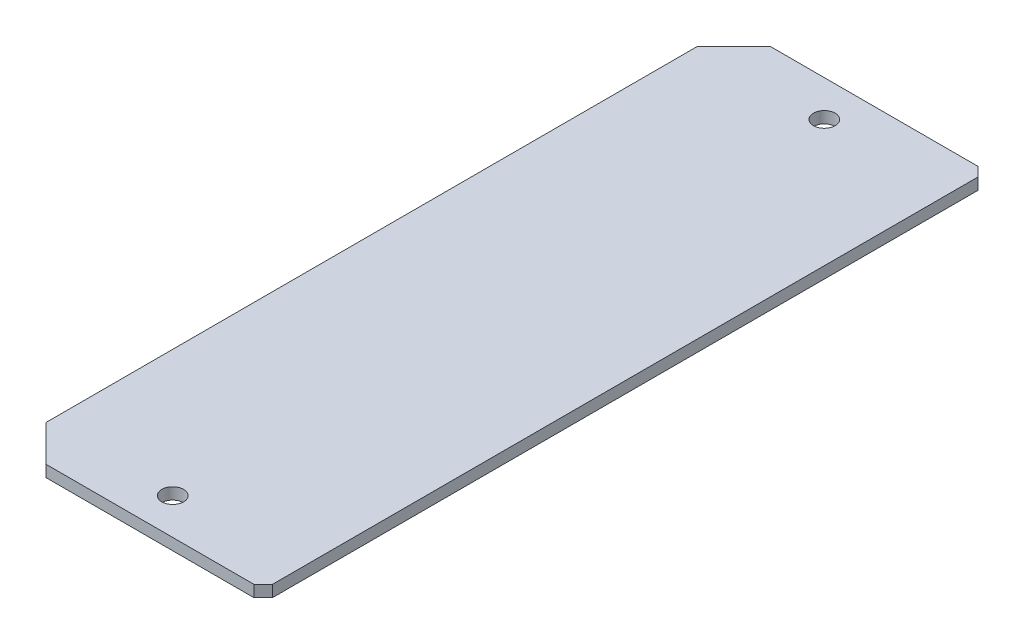
ISO-10303-21;
HEADER;
FILE_DESCRIPTION(('STEP AP214'),'2;1');
FILE_NAME('part.step','',(''),(''),'','','');
FILE_SCHEMA(('AUTOMOTIVE_DESIGN { 1 0 10303 214 1 1 1 1 }'));
ENDSEC;
DATA;
#1=APPLICATION_CONTEXT('core data for automotive mechanical design processes');
#2=APPLICATION_PROTOCOL_DEFINITION('international standard','automotive_design',2000,#1);
#3=PRODUCT_CONTEXT('',#1,'mechanical');
#4=PRODUCT('Part','Part','',(#3));
#5=PRODUCT_RELATED_PRODUCT_CATEGORY('part','',(#4));
#6=PRODUCT_DEFINITION_FORMATION('','',#4);
#7=PRODUCT_DEFINITION_CONTEXT('part definition',#1,'design');
#8=PRODUCT_DEFINITION('design','',#6,#7);
#9=PRODUCT_DEFINITION_SHAPE('','',#8);
#10=(LENGTH_UNIT() NAMED_UNIT(*) SI_UNIT(.MILLI.,.METRE.));
#11=(NAMED_UNIT(*) PLANE_ANGLE_UNIT() SI_UNIT($,.RADIAN.));
#12=(NAMED_UNIT(*) SI_UNIT($,.STERADIAN.) SOLID_ANGLE_UNIT());
#13=UNCERTAINTY_MEASURE_WITH_UNIT(LENGTH_MEASURE(1.E-05),#10,'distance_accuracy_value','');
#14=(GEOMETRIC_REPRESENTATION_CONTEXT(3) GLOBAL_UNCERTAINTY_ASSIGNED_CONTEXT((#13)) GLOBAL_UNIT_ASSIGNED_CONTEXT((#10,
#11,#12)) REPRESENTATION_CONTEXT('',''));
#15=CARTESIAN_POINT('',(0.,0.,0.));
#16=DIRECTION('',(0.,0.,1.));
#17=DIRECTION('',(1.,0.,0.));
#18=AXIS2_PLACEMENT_3D('',#15,#16,#17);
#19=CARTESIAN_POINT('',(17.5,1.6,-50.));
#20=DIRECTION('',(-1.,0.,0.));
#21=DIRECTION('',(0.,0.,1.));
#22=AXIS2_PLACEMENT_3D('',#19,#20,#21);
#23=PLANE('',#22);
#24=DIRECTION('',(0.,0.,-1.));
#25=VECTOR('',#24,1.);
#26=CARTESIAN_POINT('',(17.5,1.6,-50.));
#27=LINE('',#26,#25);
#28=CARTESIAN_POINT('',(17.5,1.6,48.73));
#29=VERTEX_POINT('',#28);
#30=CARTESIAN_POINT('',(17.5,1.6,-48.73));
#31=VERTEX_POINT('',#30);
#32=EDGE_CURVE('E130',#29,#31,#27,.T.);
#33=ORIENTED_EDGE('',*,*,#32,.F.);
#34=DIRECTION('',(0.,-1.,0.));
#35=VECTOR('',#34,1.);
#36=CARTESIAN_POINT('',(17.5,1.6,48.73));
#37=LINE('',#36,#35);
#38=CARTESIAN_POINT('',(17.5,0.,48.7300000000001));
#39=VERTEX_POINT('',#38);
#40=EDGE_CURVE('E149',#29,#39,#37,.T.);
#41=ORIENTED_EDGE('',*,*,#40,.T.);
#42=DIRECTION('',(0.,0.,-1.));
#43=VECTOR('',#42,1.);
#44=CARTESIAN_POINT('',(17.5,0.,-50.));
#45=LINE('',#44,#43);
#46=CARTESIAN_POINT('',(17.5,0.,-48.73));
#47=VERTEX_POINT('',#46);
#48=EDGE_CURVE('E132',#39,#47,#45,.T.);
#49=ORIENTED_EDGE('',*,*,#48,.T.);
#50=DIRECTION('',(0.,1.,0.));
#51=VECTOR('',#50,1.);
#52=CARTESIAN_POINT('',(17.5,1.6,-48.73));
#53=LINE('',#52,#51);
#54=EDGE_CURVE('E147',#47,#31,#53,.T.);
#55=ORIENTED_EDGE('',*,*,#54,.T.);
#56=EDGE_LOOP('',(#33,#41,#49,#55));
#57=FACE_BOUND('',#56,.T.);
#58=ADVANCED_FACE('F31',(#57),#23,.F.);
#59=CARTESIAN_POINT('',(-17.5,1.6,-50.));
#60=DIRECTION('',(0.,0.,1.));
#61=DIRECTION('',(1.,0.,0.));
#62=AXIS2_PLACEMENT_3D('',#59,#60,#61);
#63=PLANE('',#62);
#64=DIRECTION('',(-1.,0.,0.));
#65=VECTOR('',#64,1.);
#66=CARTESIAN_POINT('',(-17.5,1.6,-50.));
#67=LINE('',#66,#65);
#68=CARTESIAN_POINT('',(16.23,1.6,-50.));
#69=VERTEX_POINT('',#68);
#70=CARTESIAN_POINT('',(-12.5,1.6,-50.));
#71=VERTEX_POINT('',#70);
#72=EDGE_CURVE('E173',#69,#71,#67,.T.);
#73=ORIENTED_EDGE('',*,*,#72,.F.);
#74=DIRECTION('',(0.,-1.,0.));
#75=VECTOR('',#74,1.);
#76=CARTESIAN_POINT('',(16.23,1.6,-50.));
#77=LINE('',#76,#75);
#78=CARTESIAN_POINT('',(16.23,0.,-50.));
#79=VERTEX_POINT('',#78);
#80=EDGE_CURVE('E11',#69,#79,#77,.T.);
#81=ORIENTED_EDGE('',*,*,#80,.T.);
#82=DIRECTION('',(-1.,0.,0.));
#83=VECTOR('',#82,1.);
#84=CARTESIAN_POINT('',(-17.5,0.,-50.));
#85=LINE('',#84,#83);
#86=CARTESIAN_POINT('',(-12.5,0.,-50.));
#87=VERTEX_POINT('',#86);
#88=EDGE_CURVE('E128',#79,#87,#85,.T.);
#89=ORIENTED_EDGE('',*,*,#88,.T.);
#90=DIRECTION('',(0.,1.,0.));
#91=VECTOR('',#90,1.);
#92=CARTESIAN_POINT('',(-12.5,1.6,-50.));
#93=LINE('',#92,#91);
#94=EDGE_CURVE('E108',#87,#71,#93,.T.);
#95=ORIENTED_EDGE('',*,*,#94,.T.);
#96=EDGE_LOOP('',(#73,#81,#89,#95));
#97=FACE_BOUND('',#96,.T.);
#98=ADVANCED_FACE('F189',(#97),#63,.F.);
#99=CARTESIAN_POINT('',(-17.5,1.6,-50.));
#100=DIRECTION('',(1.,0.,0.));
#101=DIRECTION('',(0.,0.,-1.));
#102=AXIS2_PLACEMENT_3D('',#99,#100,#101);
#103=PLANE('',#102);
#104=DIRECTION('',(0.,0.,1.));
#105=VECTOR('',#104,1.);
#106=CARTESIAN_POINT('',(-17.5,1.6,-50.));
#107=LINE('',#106,#105);
#108=CARTESIAN_POINT('',(-17.5,1.6,-45.));
#109=VERTEX_POINT('',#108);
#110=CARTESIAN_POINT('',(-17.5,1.6,44.9999999999999));
#111=VERTEX_POINT('',#110);
#112=EDGE_CURVE('E121',#109,#111,#107,.T.);
#113=ORIENTED_EDGE('',*,*,#112,.F.);
#114=DIRECTION('',(0.,-1.,0.));
#115=VECTOR('',#114,1.);
#116=CARTESIAN_POINT('',(-17.5,1.6,-45.));
#117=LINE('',#116,#115);
#118=CARTESIAN_POINT('',(-17.5,0.,-45.));
#119=VERTEX_POINT('',#118);
#120=EDGE_CURVE('E106',#109,#119,#117,.T.);
#121=ORIENTED_EDGE('',*,*,#120,.T.);
#122=DIRECTION('',(0.,0.,1.));
#123=VECTOR('',#122,1.);
#124=CARTESIAN_POINT('',(-17.5,0.,-50.));
#125=LINE('',#124,#123);
#126=CARTESIAN_POINT('',(-17.5,0.,45.));
#127=VERTEX_POINT('',#126);
#128=EDGE_CURVE('E118',#119,#127,#125,.T.);
#129=ORIENTED_EDGE('',*,*,#128,.T.);
#130=DIRECTION('',(0.,1.,0.));
#131=VECTOR('',#130,1.);
#132=CARTESIAN_POINT('',(-17.5,1.6,45.));
#133=LINE('',#132,#131);
#134=EDGE_CURVE('E122',#127,#111,#133,.T.);
#135=ORIENTED_EDGE('',*,*,#134,.T.);
#136=EDGE_LOOP('',(#113,#121,#129,#135));
#137=FACE_BOUND('',#136,.T.);
#138=ADVANCED_FACE('F117',(#137),#103,.F.);
#139=CARTESIAN_POINT('',(-17.5,1.6,50.));
#140=DIRECTION('',(0.,0.,-1.));
#141=DIRECTION('',(-1.,0.,0.));
#142=AXIS2_PLACEMENT_3D('',#139,#140,#141);
#143=PLANE('',#142);
#144=DIRECTION('',(1.,0.,0.));
#145=VECTOR('',#144,1.);
#146=CARTESIAN_POINT('',(-17.5,0.,50.));
#147=LINE('',#146,#145);
#148=CARTESIAN_POINT('',(-12.5,0.,50.));
#149=VERTEX_POINT('',#148);
#150=CARTESIAN_POINT('',(16.23,0.,50.));
#151=VERTEX_POINT('',#150);
#152=EDGE_CURVE('E127',#149,#151,#147,.T.);
#153=ORIENTED_EDGE('',*,*,#152,.T.);
#154=DIRECTION('',(0.,1.,0.));
#155=VECTOR('',#154,1.);
#156=CARTESIAN_POINT('',(16.23,1.6,50.));
#157=LINE('',#156,#155);
#158=CARTESIAN_POINT('',(16.23,1.6,50.));
#159=VERTEX_POINT('',#158);
#160=EDGE_CURVE('E56',#151,#159,#157,.T.);
#161=ORIENTED_EDGE('',*,*,#160,.T.);
#162=DIRECTION('',(1.,0.,0.));
#163=VECTOR('',#162,1.);
#164=CARTESIAN_POINT('',(-17.5,1.6,50.));
#165=LINE('',#164,#163);
#166=CARTESIAN_POINT('',(-12.5,1.6,50.));
#167=VERTEX_POINT('',#166);
#168=EDGE_CURVE('E136',#167,#159,#165,.T.);
#169=ORIENTED_EDGE('',*,*,#168,.F.);
#170=DIRECTION('',(0.,-1.,0.));
#171=VECTOR('',#170,1.);
#172=CARTESIAN_POINT('',(-12.5,1.6,50.));
#173=LINE('',#172,#171);
#174=EDGE_CURVE('E144',#167,#149,#173,.T.);
#175=ORIENTED_EDGE('',*,*,#174,.T.);
#176=EDGE_LOOP('',(#153,#161,#169,#175));
#177=FACE_BOUND('',#176,.T.);
#178=ADVANCED_FACE('F192',(#177),#143,.F.);
#179=CARTESIAN_POINT('',(17.5,1.6,50.));
#180=DIRECTION('',(0.,1.,0.));
#181=DIRECTION('',(0.,0.,1.));
#182=AXIS2_PLACEMENT_3D('',#179,#180,#181);
#183=PLANE('',#182);
#184=CARTESIAN_POINT('',(0.,1.6,45.));
#185=DIRECTION('',(0.,1.,0.));
#186=DIRECTION('',(0.,0.,1.));
#187=AXIS2_PLACEMENT_3D('',#184,#185,#186);
#188=CIRCLE('',#187,1.5);
#189=CARTESIAN_POINT('',(0.,1.6,46.5));
#190=VERTEX_POINT('',#189);
#191=EDGE_CURVE('E169',#190,#190,#188,.T.);
#192=ORIENTED_EDGE('',*,*,#191,.F.);
#193=EDGE_LOOP('',(#192));
#194=FACE_BOUND('',#193,.T.);
#195=CARTESIAN_POINT('',(0.,1.6,-45.));
#196=DIRECTION('',(0.,1.,0.));
#197=DIRECTION('',(0.,0.,1.));
#198=AXIS2_PLACEMENT_3D('',#195,#196,#197);
#199=CIRCLE('',#198,1.5);
#200=CARTESIAN_POINT('',(0.,1.6,-43.5));
#201=VERTEX_POINT('',#200);
#202=EDGE_CURVE('E160',#201,#201,#199,.T.);
#203=ORIENTED_EDGE('',*,*,#202,.F.);
#204=EDGE_LOOP('',(#203));
#205=FACE_BOUND('',#204,.T.);
#206=ORIENTED_EDGE('',*,*,#168,.T.);
#207=DIRECTION('',(-0.707106781186551,0.,0.707106781186544));
#208=VECTOR('',#207,1.);
#209=CARTESIAN_POINT('',(16.865,1.6,49.365));
#210=LINE('',#209,#208);
#211=EDGE_CURVE('E40',#159,#29,#210,.F.);
#212=ORIENTED_EDGE('',*,*,#211,.T.);
#213=ORIENTED_EDGE('',*,*,#32,.T.);
#214=DIRECTION('',(0.707106781186548,0.,0.707106781186548));
#215=VECTOR('',#214,1.);
#216=CARTESIAN_POINT('',(66.865,1.6,0.635000000000018));
#217=LINE('',#216,#215);
#218=EDGE_CURVE('E48',#31,#69,#217,.F.);
#219=ORIENTED_EDGE('',*,*,#218,.T.);
#220=ORIENTED_EDGE('',*,*,#72,.T.);
#221=DIRECTION('',(0.707106781186549,0.,-0.707106781186546));
#222=VECTOR('',#221,1.);
#223=CARTESIAN_POINT('',(-47.4999999999999,1.6,-15.0000000000003));
#224=LINE('',#223,#222);
#225=EDGE_CURVE('E142',#71,#109,#224,.F.);
#226=ORIENTED_EDGE('',*,*,#225,.T.);
#227=ORIENTED_EDGE('',*,*,#112,.T.);
#228=DIRECTION('',(-0.707106781186547,0.,-0.707106781186549));
#229=VECTOR('',#228,1.);
#230=CARTESIAN_POINT('',(2.49999999999997,1.6,65.));
#231=LINE('',#230,#229);
#232=EDGE_CURVE('E140',#111,#167,#231,.F.);
#233=ORIENTED_EDGE('',*,*,#232,.T.);
#234=EDGE_LOOP('',(#206,#212,#213,#219,#220,#226,#227,#233));
#235=FACE_BOUND('',#234,.T.);
#236=ADVANCED_FACE('F177',(#194,#205,#235),#183,.T.);
#237=CARTESIAN_POINT('',(17.5,0.,50.));
#238=DIRECTION('',(0.,1.,0.));
#239=DIRECTION('',(0.,0.,1.));
#240=AXIS2_PLACEMENT_3D('',#237,#238,#239);
#241=PLANE('',#240);
#242=CARTESIAN_POINT('',(0.,0.,45.));
#243=DIRECTION('',(0.,1.,0.));
#244=DIRECTION('',(0.,0.,1.));
#245=AXIS2_PLACEMENT_3D('',#242,#243,#244);
#246=CIRCLE('',#245,1.5);
#247=CARTESIAN_POINT('',(0.,0.,46.5));
#248=VERTEX_POINT('',#247);
#249=EDGE_CURVE('E35',#248,#248,#246,.T.);
#250=ORIENTED_EDGE('',*,*,#249,.T.);
#251=EDGE_LOOP('',(#250));
#252=FACE_BOUND('',#251,.T.);
#253=CARTESIAN_POINT('',(0.,0.,-45.));
#254=DIRECTION('',(0.,1.,0.));
#255=DIRECTION('',(0.,0.,1.));
#256=AXIS2_PLACEMENT_3D('',#253,#254,#255);
#257=CIRCLE('',#256,1.5);
#258=CARTESIAN_POINT('',(0.,0.,-43.5));
#259=VERTEX_POINT('',#258);
#260=EDGE_CURVE('E158',#259,#259,#257,.T.);
#261=ORIENTED_EDGE('',*,*,#260,.T.);
#262=EDGE_LOOP('',(#261));
#263=FACE_BOUND('',#262,.T.);
#264=ORIENTED_EDGE('',*,*,#48,.F.);
#265=DIRECTION('',(0.707106781186551,0.,-0.707106781186544));
#266=VECTOR('',#265,1.);
#267=CARTESIAN_POINT('',(17.5,0.,48.73));
#268=LINE('',#267,#266);
#269=EDGE_CURVE('E154',#39,#151,#268,.F.);
#270=ORIENTED_EDGE('',*,*,#269,.T.);
#271=ORIENTED_EDGE('',*,*,#152,.F.);
#272=DIRECTION('',(0.707106781186547,0.,0.707106781186549));
#273=VECTOR('',#272,1.);
#274=CARTESIAN_POINT('',(-12.5,0.,50.));
#275=LINE('',#274,#273);
#276=EDGE_CURVE('E112',#149,#127,#275,.F.);
#277=ORIENTED_EDGE('',*,*,#276,.T.);
#278=ORIENTED_EDGE('',*,*,#128,.F.);
#279=DIRECTION('',(-0.707106781186549,0.,0.707106781186546));
#280=VECTOR('',#279,1.);
#281=CARTESIAN_POINT('',(-17.5,0.,-45.));
#282=LINE('',#281,#280);
#283=EDGE_CURVE('E102',#119,#87,#282,.F.);
#284=ORIENTED_EDGE('',*,*,#283,.T.);
#285=ORIENTED_EDGE('',*,*,#88,.F.);
#286=DIRECTION('',(-0.707106781186548,0.,-0.707106781186548));
#287=VECTOR('',#286,1.);
#288=CARTESIAN_POINT('',(16.23,0.,-50.));
#289=LINE('',#288,#287);
#290=EDGE_CURVE('E152',#79,#47,#289,.F.);
#291=ORIENTED_EDGE('',*,*,#290,.T.);
#292=EDGE_LOOP('',(#264,#270,#271,#277,#278,#284,#285,#291));
#293=FACE_BOUND('',#292,.T.);
#294=ADVANCED_FACE('F125',(#252,#263,#293),#241,.F.);
#295=CARTESIAN_POINT('',(-17.5,1.6,-45.));
#296=DIRECTION('',(0.707106781186545,0.,0.707106781186549));
#297=DIRECTION('',(0.707106781186549,0.,-0.707106781186546));
#298=AXIS2_PLACEMENT_3D('',#295,#296,#297);
#299=PLANE('',#298);
#300=ORIENTED_EDGE('',*,*,#225,.F.);
#301=ORIENTED_EDGE('',*,*,#94,.F.);
#302=ORIENTED_EDGE('',*,*,#283,.F.);
#303=ORIENTED_EDGE('',*,*,#120,.F.);
#304=EDGE_LOOP('',(#300,#301,#302,#303));
#305=FACE_BOUND('',#304,.T.);
#306=ADVANCED_FACE('F105',(#305),#299,.F.);
#307=CARTESIAN_POINT('',(-12.5,1.6,50.));
#308=DIRECTION('',(0.707106781186549,0.,-0.707106781186547));
#309=DIRECTION('',(-0.707106781186547,0.,-0.707106781186549));
#310=AXIS2_PLACEMENT_3D('',#307,#308,#309);
#311=PLANE('',#310);
#312=ORIENTED_EDGE('',*,*,#232,.F.);
#313=ORIENTED_EDGE('',*,*,#134,.F.);
#314=ORIENTED_EDGE('',*,*,#276,.F.);
#315=ORIENTED_EDGE('',*,*,#174,.F.);
#316=EDGE_LOOP('',(#312,#313,#314,#315));
#317=FACE_BOUND('',#316,.T.);
#318=ADVANCED_FACE('F191',(#317),#311,.F.);
#319=CARTESIAN_POINT('',(17.5,1.6,48.73));
#320=DIRECTION('',(-0.707106781186544,0.,-0.707106781186551));
#321=DIRECTION('',(-0.707106781186551,0.,0.707106781186544));
#322=AXIS2_PLACEMENT_3D('',#319,#320,#321);
#323=PLANE('',#322);
#324=ORIENTED_EDGE('',*,*,#211,.F.);
#325=ORIENTED_EDGE('',*,*,#160,.F.);
#326=ORIENTED_EDGE('',*,*,#269,.F.);
#327=ORIENTED_EDGE('',*,*,#40,.F.);
#328=EDGE_LOOP('',(#324,#325,#326,#327));
#329=FACE_BOUND('',#328,.T.);
#330=ADVANCED_FACE('F183',(#329),#323,.F.);
#331=CARTESIAN_POINT('',(16.23,1.6,-50.));
#332=DIRECTION('',(-0.707106781186547,0.,0.707106781186547));
#333=DIRECTION('',(0.707106781186548,0.,0.707106781186548));
#334=AXIS2_PLACEMENT_3D('',#331,#332,#333);
#335=PLANE('',#334);
#336=ORIENTED_EDGE('',*,*,#218,.F.);
#337=ORIENTED_EDGE('',*,*,#54,.F.);
#338=ORIENTED_EDGE('',*,*,#290,.F.);
#339=ORIENTED_EDGE('',*,*,#80,.F.);
#340=EDGE_LOOP('',(#336,#337,#338,#339));
#341=FACE_BOUND('',#340,.T.);
#342=ADVANCED_FACE('F33',(#341),#335,.F.);
#343=CARTESIAN_POINT('',(0.,-8.4,-45.));
#344=DIRECTION('',(0.,1.,0.));
#345=DIRECTION('',(0.,0.,1.));
#346=AXIS2_PLACEMENT_3D('',#343,#344,#345);
#347=CYLINDRICAL_SURFACE('',#346,1.5);
#348=ORIENTED_EDGE('',*,*,#202,.T.);
#349=EDGE_LOOP('',(#348));
#350=FACE_BOUND('',#349,.T.);
#351=ORIENTED_EDGE('',*,*,#260,.F.);
#352=EDGE_LOOP('',(#351));
#353=FACE_BOUND('',#352,.T.);
#354=ADVANCED_FACE('F217',(#350,#353),#347,.F.);
#355=CARTESIAN_POINT('',(0.,-8.4,45.));
#356=DIRECTION('',(0.,1.,0.));
#357=DIRECTION('',(0.,0.,1.));
#358=AXIS2_PLACEMENT_3D('',#355,#356,#357);
#359=CYLINDRICAL_SURFACE('',#358,1.5);
#360=ORIENTED_EDGE('',*,*,#191,.T.);
#361=EDGE_LOOP('',(#360));
#362=FACE_BOUND('',#361,.T.);
#363=ORIENTED_EDGE('',*,*,#249,.F.);
#364=EDGE_LOOP('',(#363));
#365=FACE_BOUND('',#364,.T.);
#366=ADVANCED_FACE('F221',(#362,#365),#359,.F.);
#367=CLOSED_SHELL('',(#58,#98,#138,#178,#236,#294,#306,#318,#330,#342,#354,#366));
#368=MANIFOLD_SOLID_BREP('B2',#367);
#369=ADVANCED_BREP_SHAPE_REPRESENTATION('',(#18,#368),#14);
#370=SHAPE_DEFINITION_REPRESENTATION(#9,#369);
ENDSEC;
END-ISO-10303-21;
